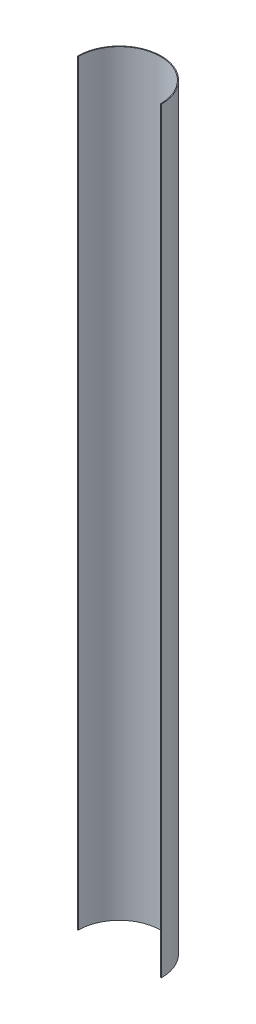
ISO-10303-21;
HEADER;
FILE_DESCRIPTION(('STEP AP214'),'2;1');
FILE_NAME('part.step','',(''),(''),'','','');
FILE_SCHEMA(('AUTOMOTIVE_DESIGN { 1 0 10303 214 1 1 1 1 }'));
ENDSEC;
DATA;
#1=APPLICATION_CONTEXT('core data for automotive mechanical design processes');
#2=APPLICATION_PROTOCOL_DEFINITION('international standard','automotive_design',2000,#1);
#3=PRODUCT_CONTEXT('',#1,'mechanical');
#4=PRODUCT('Part','Part','',(#3));
#5=PRODUCT_RELATED_PRODUCT_CATEGORY('part','',(#4));
#6=PRODUCT_DEFINITION_FORMATION('','',#4);
#7=PRODUCT_DEFINITION_CONTEXT('part definition',#1,'design');
#8=PRODUCT_DEFINITION('design','',#6,#7);
#9=PRODUCT_DEFINITION_SHAPE('','',#8);
#10=(LENGTH_UNIT() NAMED_UNIT(*) SI_UNIT(.MILLI.,.METRE.));
#11=(NAMED_UNIT(*) PLANE_ANGLE_UNIT() SI_UNIT($,.RADIAN.));
#12=(NAMED_UNIT(*) SI_UNIT($,.STERADIAN.) SOLID_ANGLE_UNIT());
#13=UNCERTAINTY_MEASURE_WITH_UNIT(LENGTH_MEASURE(1.E-05),#10,'distance_accuracy_value','');
#14=(GEOMETRIC_REPRESENTATION_CONTEXT(3) GLOBAL_UNCERTAINTY_ASSIGNED_CONTEXT((#13)) GLOBAL_UNIT_ASSIGNED_CONTEXT((#10,
#11,#12)) REPRESENTATION_CONTEXT('',''));
#15=CARTESIAN_POINT('',(0.,0.,0.));
#16=DIRECTION('',(0.,0.,1.));
#17=DIRECTION('',(1.,0.,0.));
#18=AXIS2_PLACEMENT_3D('',#15,#16,#17);
#19=CARTESIAN_POINT('',(0.,1400.,0.));
#20=DIRECTION('',(0.,1.,0.));
#21=DIRECTION('',(0.,0.,1.));
#22=AXIS2_PLACEMENT_3D('',#19,#20,#21);
#23=PLANE('',#22);
#24=DIRECTION('',(1.,0.,0.));
#25=VECTOR('',#24,1.);
#26=CARTESIAN_POINT('',(105.56373506584,1400.,0.));
#27=LINE('',#26,#25);
#28=CARTESIAN_POINT('',(76.,1400.,0.));
#29=VERTEX_POINT('',#28);
#30=CARTESIAN_POINT('',(77.5,1400.,0.));
#31=VERTEX_POINT('',#30);
#32=EDGE_CURVE('E59',#29,#31,#27,.T.);
#33=ORIENTED_EDGE('',*,*,#32,.T.);
#34=CARTESIAN_POINT('',(0.,1400.,0.));
#35=DIRECTION('',(0.,1.,0.));
#36=DIRECTION('',(0.,0.,1.));
#37=AXIS2_PLACEMENT_3D('',#34,#35,#36);
#38=CIRCLE('',#37,77.5);
#39=CARTESIAN_POINT('',(-77.5,1400.,0.));
#40=VERTEX_POINT('',#39);
#41=EDGE_CURVE('E96',#31,#40,#38,.T.);
#42=ORIENTED_EDGE('',*,*,#41,.T.);
#43=CARTESIAN_POINT('',(-76.,1400.,0.));
#44=VERTEX_POINT('',#43);
#45=EDGE_CURVE('E78',#40,#44,#27,.T.);
#46=ORIENTED_EDGE('',*,*,#45,.T.);
#47=CARTESIAN_POINT('',(0.,1400.,0.));
#48=DIRECTION('',(0.,1.,0.));
#49=DIRECTION('',(0.,0.,1.));
#50=AXIS2_PLACEMENT_3D('',#47,#48,#49);
#51=CIRCLE('',#50,76.);
#52=EDGE_CURVE('E97',#29,#44,#51,.T.);
#53=ORIENTED_EDGE('',*,*,#52,.F.);
#54=EDGE_LOOP('',(#33,#42,#46,#53));
#55=FACE_BOUND('',#54,.T.);
#56=ADVANCED_FACE('F37',(#55),#23,.T.);
#57=CARTESIAN_POINT('',(0.,0.,0.));
#58=DIRECTION('',(0.,1.,0.));
#59=DIRECTION('',(0.,0.,1.));
#60=AXIS2_PLACEMENT_3D('',#57,#58,#59);
#61=PLANE('',#60);
#62=CARTESIAN_POINT('',(0.,0.,0.));
#63=DIRECTION('',(0.,1.,0.));
#64=DIRECTION('',(0.,0.,1.));
#65=AXIS2_PLACEMENT_3D('',#62,#63,#64);
#66=CIRCLE('',#65,77.5);
#67=CARTESIAN_POINT('',(77.5,0.,0.));
#68=VERTEX_POINT('',#67);
#69=CARTESIAN_POINT('',(-77.5,0.,0.));
#70=VERTEX_POINT('',#69);
#71=EDGE_CURVE('E90',#68,#70,#66,.T.);
#72=ORIENTED_EDGE('',*,*,#71,.F.);
#73=DIRECTION('',(1.,0.,0.));
#74=VECTOR('',#73,1.);
#75=CARTESIAN_POINT('',(105.56373506584,0.,0.));
#76=LINE('',#75,#74);
#77=CARTESIAN_POINT('',(76.,0.,0.));
#78=VERTEX_POINT('',#77);
#79=EDGE_CURVE('E93',#78,#68,#76,.T.);
#80=ORIENTED_EDGE('',*,*,#79,.F.);
#81=CARTESIAN_POINT('',(0.,0.,0.));
#82=DIRECTION('',(0.,1.,0.));
#83=DIRECTION('',(0.,0.,1.));
#84=AXIS2_PLACEMENT_3D('',#81,#82,#83);
#85=CIRCLE('',#84,76.);
#86=CARTESIAN_POINT('',(-76.,0.,0.));
#87=VERTEX_POINT('',#86);
#88=EDGE_CURVE('E92',#78,#87,#85,.T.);
#89=ORIENTED_EDGE('',*,*,#88,.T.);
#90=EDGE_CURVE('E52',#70,#87,#76,.T.);
#91=ORIENTED_EDGE('',*,*,#90,.F.);
#92=EDGE_LOOP('',(#72,#80,#89,#91));
#93=FACE_BOUND('',#92,.T.);
#94=ADVANCED_FACE('F88',(#93),#61,.F.);
#95=CARTESIAN_POINT('',(0.,1400.,0.));
#96=DIRECTION('',(0.,-1.,0.));
#97=DIRECTION('',(0.,0.,-1.));
#98=AXIS2_PLACEMENT_3D('',#95,#96,#97);
#99=CYLINDRICAL_SURFACE('',#98,77.5);
#100=ORIENTED_EDGE('',*,*,#41,.F.);
#101=DIRECTION('',(0.,-1.,0.));
#102=VECTOR('',#101,1.);
#103=CARTESIAN_POINT('',(77.5,1400.,0.));
#104=LINE('',#103,#102);
#105=EDGE_CURVE('E83',#31,#68,#104,.T.);
#106=ORIENTED_EDGE('',*,*,#105,.T.);
#107=ORIENTED_EDGE('',*,*,#71,.T.);
#108=DIRECTION('',(0.,-1.,0.));
#109=VECTOR('',#108,1.);
#110=CARTESIAN_POINT('',(-77.5,1400.,0.));
#111=LINE('',#110,#109);
#112=EDGE_CURVE('E75',#70,#40,#111,.F.);
#113=ORIENTED_EDGE('',*,*,#112,.T.);
#114=EDGE_LOOP('',(#100,#106,#107,#113));
#115=FACE_BOUND('',#114,.T.);
#116=ADVANCED_FACE('F39',(#115),#99,.T.);
#117=CARTESIAN_POINT('',(0.,1400.,0.));
#118=DIRECTION('',(0.,-1.,0.));
#119=DIRECTION('',(0.,0.,-1.));
#120=AXIS2_PLACEMENT_3D('',#117,#118,#119);
#121=CYLINDRICAL_SURFACE('',#120,76.);
#122=DIRECTION('',(0.,-1.,0.));
#123=VECTOR('',#122,1.);
#124=CARTESIAN_POINT('',(76.,1400.,0.));
#125=LINE('',#124,#123);
#126=EDGE_CURVE('E11',#29,#78,#125,.T.);
#127=ORIENTED_EDGE('',*,*,#126,.F.);
#128=ORIENTED_EDGE('',*,*,#52,.T.);
#129=DIRECTION('',(0.,-1.,0.));
#130=VECTOR('',#129,1.);
#131=CARTESIAN_POINT('',(-76.,1400.,0.));
#132=LINE('',#131,#130);
#133=EDGE_CURVE('E45',#87,#44,#132,.F.);
#134=ORIENTED_EDGE('',*,*,#133,.F.);
#135=ORIENTED_EDGE('',*,*,#88,.F.);
#136=EDGE_LOOP('',(#127,#128,#134,#135));
#137=FACE_BOUND('',#136,.T.);
#138=ADVANCED_FACE('F107',(#137),#121,.F.);
#139=CARTESIAN_POINT('',(105.56373506584,1400.,0.));
#140=DIRECTION('',(0.,0.,-1.));
#141=DIRECTION('',(-1.,0.,0.));
#142=AXIS2_PLACEMENT_3D('',#139,#140,#141);
#143=PLANE('',#142);
#144=ORIENTED_EDGE('',*,*,#90,.T.);
#145=ORIENTED_EDGE('',*,*,#133,.T.);
#146=ORIENTED_EDGE('',*,*,#45,.F.);
#147=ORIENTED_EDGE('',*,*,#112,.F.);
#148=EDGE_LOOP('',(#144,#145,#146,#147));
#149=FACE_BOUND('',#148,.T.);
#150=ADVANCED_FACE('F76',(#149),#143,.F.);
#151=ORIENTED_EDGE('',*,*,#32,.F.);
#152=ORIENTED_EDGE('',*,*,#126,.T.);
#153=ORIENTED_EDGE('',*,*,#79,.T.);
#154=ORIENTED_EDGE('',*,*,#105,.F.);
#155=EDGE_LOOP('',(#151,#152,#153,#154));
#156=FACE_BOUND('',#155,.T.);
#157=ADVANCED_FACE('F108',(#156),#143,.F.);
#158=CLOSED_SHELL('',(#56,#94,#116,#138,#150,#157));
#159=MANIFOLD_SOLID_BREP('B2',#158);
#160=ADVANCED_BREP_SHAPE_REPRESENTATION('',(#18,#159),#14);
#161=SHAPE_DEFINITION_REPRESENTATION(#9,#160);
ENDSEC;
END-ISO-10303-21;
